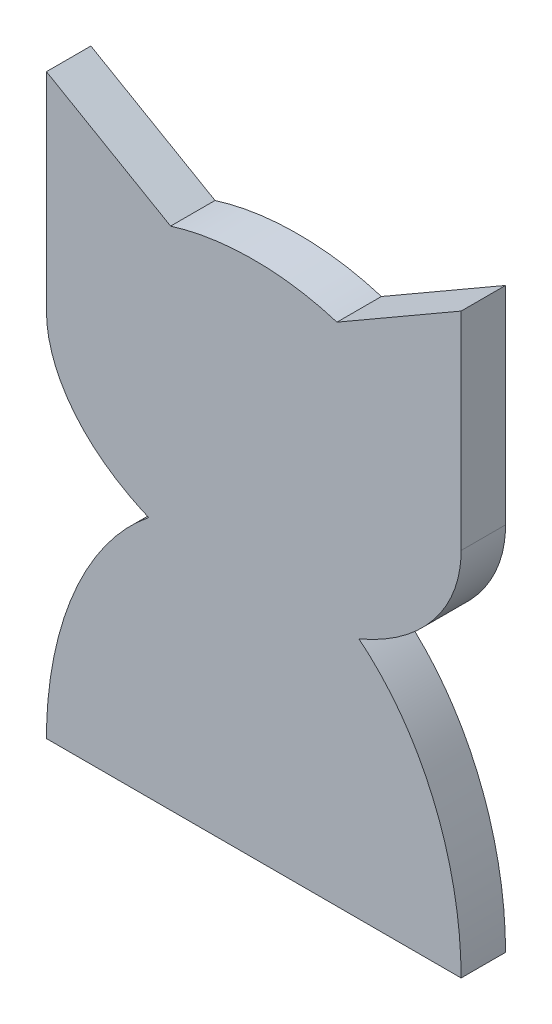
ISO-10303-21;
HEADER;
FILE_DESCRIPTION(('STEP AP214'),'2;1');
FILE_NAME('part.step','',(''),(''),'','','');
FILE_SCHEMA(('AUTOMOTIVE_DESIGN { 1 0 10303 214 1 1 1 1 }'));
ENDSEC;
DATA;
#1=APPLICATION_CONTEXT('core data for automotive mechanical design processes');
#2=APPLICATION_PROTOCOL_DEFINITION('international standard','automotive_design',2000,#1);
#3=PRODUCT_CONTEXT('',#1,'mechanical');
#4=PRODUCT('Part','Part','',(#3));
#5=PRODUCT_RELATED_PRODUCT_CATEGORY('part','',(#4));
#6=PRODUCT_DEFINITION_FORMATION('','',#4);
#7=PRODUCT_DEFINITION_CONTEXT('part definition',#1,'design');
#8=PRODUCT_DEFINITION('design','',#6,#7);
#9=PRODUCT_DEFINITION_SHAPE('','',#8);
#10=(LENGTH_UNIT() NAMED_UNIT(*) SI_UNIT(.MILLI.,.METRE.));
#11=(NAMED_UNIT(*) PLANE_ANGLE_UNIT() SI_UNIT($,.RADIAN.));
#12=(NAMED_UNIT(*) SI_UNIT($,.STERADIAN.) SOLID_ANGLE_UNIT());
#13=UNCERTAINTY_MEASURE_WITH_UNIT(LENGTH_MEASURE(1.E-05),#10,'distance_accuracy_value','');
#14=(GEOMETRIC_REPRESENTATION_CONTEXT(3) GLOBAL_UNCERTAINTY_ASSIGNED_CONTEXT((#13)) GLOBAL_UNIT_ASSIGNED_CONTEXT((#10,
#11,#12)) REPRESENTATION_CONTEXT('',''));
#15=CARTESIAN_POINT('',(0.,0.,0.));
#16=DIRECTION('',(0.,0.,1.));
#17=DIRECTION('',(1.,0.,0.));
#18=AXIS2_PLACEMENT_3D('',#15,#16,#17);
#19=CARTESIAN_POINT('',(11.,25.,3.));
#20=DIRECTION('',(-1.,0.,0.));
#21=DIRECTION('',(0.,0.,1.));
#22=AXIS2_PLACEMENT_3D('',#19,#20,#21);
#23=PLANE('',#22);
#24=DIRECTION('',(0.,1.,0.));
#25=VECTOR('',#24,1.);
#26=CARTESIAN_POINT('',(11.,25.,0.));
#27=LINE('',#26,#25);
#28=CARTESIAN_POINT('',(11.,25.,0.));
#29=VERTEX_POINT('',#28);
#30=CARTESIAN_POINT('',(11.,39.,0.));
#31=VERTEX_POINT('',#30);
#32=EDGE_CURVE('E200',#29,#31,#27,.T.);
#33=ORIENTED_EDGE('',*,*,#32,.F.);
#34=DIRECTION('',(0.,0.,-1.));
#35=VECTOR('',#34,1.);
#36=CARTESIAN_POINT('',(11.,25.,3.));
#37=LINE('',#36,#35);
#38=CARTESIAN_POINT('',(11.,25.,3.));
#39=VERTEX_POINT('',#38);
#40=EDGE_CURVE('E11',#39,#29,#37,.T.);
#41=ORIENTED_EDGE('',*,*,#40,.F.);
#42=DIRECTION('',(0.,1.,0.));
#43=VECTOR('',#42,1.);
#44=CARTESIAN_POINT('',(11.,25.,3.));
#45=LINE('',#44,#43);
#46=CARTESIAN_POINT('',(11.,39.,3.));
#47=VERTEX_POINT('',#46);
#48=EDGE_CURVE('E220',#39,#47,#45,.T.);
#49=ORIENTED_EDGE('',*,*,#48,.T.);
#50=DIRECTION('',(0.,0.,-1.));
#51=VECTOR('',#50,1.);
#52=CARTESIAN_POINT('',(11.,39.,3.));
#53=LINE('',#52,#51);
#54=EDGE_CURVE('E44',#47,#31,#53,.T.);
#55=ORIENTED_EDGE('',*,*,#54,.T.);
#56=EDGE_LOOP('',(#33,#41,#49,#55));
#57=FACE_BOUND('',#56,.T.);
#58=ADVANCED_FACE('F41',(#57),#23,.T.);
#59=CARTESIAN_POINT('',(25.,25.,3.));
#60=DIRECTION('',(0.,0.,1.));
#61=DIRECTION('',(1.,0.,0.));
#62=AXIS2_PLACEMENT_3D('',#59,#60,#61);
#63=ELLIPSE('',#62,14.,10.);
#64=DIRECTION('',(0.,0.,-1.));
#65=VECTOR('',#64,1.);
#66=SURFACE_OF_LINEAR_EXTRUSION('',#63,#65);
#67=CARTESIAN_POINT('',(25.,25.,0.));
#68=DIRECTION('',(0.,0.,1.));
#69=DIRECTION('',(1.,0.,0.));
#70=AXIS2_PLACEMENT_3D('',#67,#68,#69);
#71=ELLIPSE('',#70,14.,10.);
#72=CARTESIAN_POINT('',(17.9049262622832,16.3793103448276,0.));
#73=VERTEX_POINT('',#72);
#74=EDGE_CURVE('E92',#29,#73,#71,.T.);
#75=ORIENTED_EDGE('',*,*,#74,.T.);
#76=DIRECTION('',(0.,0.,-1.));
#77=VECTOR('',#76,1.);
#78=CARTESIAN_POINT('',(17.9049262622832,16.3793103448276,3.));
#79=LINE('',#78,#77);
#80=CARTESIAN_POINT('',(17.9049262622832,16.3793103448276,3.));
#81=VERTEX_POINT('',#80);
#82=EDGE_CURVE('E50',#81,#73,#79,.T.);
#83=ORIENTED_EDGE('',*,*,#82,.F.);
#84=EDGE_CURVE('E129',#39,#81,#63,.T.);
#85=ORIENTED_EDGE('',*,*,#84,.F.);
#86=ORIENTED_EDGE('',*,*,#40,.T.);
#87=EDGE_LOOP('',(#75,#83,#85,#86));
#88=FACE_BOUND('',#87,.T.);
#89=ADVANCED_FACE('F158',(#88),#66,.F.);
#90=CARTESIAN_POINT('',(25.,0.,3.));
#91=DIRECTION('',(0.,0.,1.));
#92=DIRECTION('',(0.,1.,0.));
#93=AXIS2_PLACEMENT_3D('',#90,#91,#92);
#94=ELLIPSE('',#93,19.,14.);
#95=DIRECTION('',(0.,0.,-1.));
#96=VECTOR('',#95,1.);
#97=SURFACE_OF_LINEAR_EXTRUSION('',#94,#96);
#98=CARTESIAN_POINT('',(25.,0.,0.));
#99=DIRECTION('',(0.,0.,1.));
#100=DIRECTION('',(0.,1.,0.));
#101=AXIS2_PLACEMENT_3D('',#98,#99,#100);
#102=ELLIPSE('',#101,19.,14.);
#103=CARTESIAN_POINT('',(11.,0.,0.));
#104=VERTEX_POINT('',#103);
#105=EDGE_CURVE('E136',#73,#104,#102,.T.);
#106=ORIENTED_EDGE('',*,*,#105,.T.);
#107=DIRECTION('',(0.,0.,-1.));
#108=VECTOR('',#107,1.);
#109=CARTESIAN_POINT('',(11.,0.,3.));
#110=LINE('',#109,#108);
#111=CARTESIAN_POINT('',(11.,0.,3.));
#112=VERTEX_POINT('',#111);
#113=EDGE_CURVE('E133',#112,#104,#110,.T.);
#114=ORIENTED_EDGE('',*,*,#113,.F.);
#115=EDGE_CURVE('E122',#81,#112,#94,.T.);
#116=ORIENTED_EDGE('',*,*,#115,.F.);
#117=ORIENTED_EDGE('',*,*,#82,.T.);
#118=EDGE_LOOP('',(#106,#114,#116,#117));
#119=FACE_BOUND('',#118,.T.);
#120=ADVANCED_FACE('F134',(#119),#97,.F.);
#121=CARTESIAN_POINT('',(11.,0.,3.));
#122=DIRECTION('',(0.,1.,0.));
#123=DIRECTION('',(-1.,0.,0.));
#124=AXIS2_PLACEMENT_3D('',#121,#122,#123);
#125=PLANE('',#124);
#126=DIRECTION('',(1.,0.,0.));
#127=VECTOR('',#126,1.);
#128=CARTESIAN_POINT('',(11.,0.,0.));
#129=LINE('',#128,#127);
#130=CARTESIAN_POINT('',(39.,0.,0.));
#131=VERTEX_POINT('',#130);
#132=EDGE_CURVE('E217',#104,#131,#129,.T.);
#133=ORIENTED_EDGE('',*,*,#132,.T.);
#134=DIRECTION('',(0.,0.,-1.));
#135=VECTOR('',#134,1.);
#136=CARTESIAN_POINT('',(39.,0.,3.));
#137=LINE('',#136,#135);
#138=CARTESIAN_POINT('',(39.,0.,3.));
#139=VERTEX_POINT('',#138);
#140=EDGE_CURVE('E139',#139,#131,#137,.T.);
#141=ORIENTED_EDGE('',*,*,#140,.F.);
#142=DIRECTION('',(1.,0.,0.));
#143=VECTOR('',#142,1.);
#144=CARTESIAN_POINT('',(11.,0.,3.));
#145=LINE('',#144,#143);
#146=EDGE_CURVE('E127',#112,#139,#145,.T.);
#147=ORIENTED_EDGE('',*,*,#146,.F.);
#148=ORIENTED_EDGE('',*,*,#113,.T.);
#149=EDGE_LOOP('',(#133,#141,#147,#148));
#150=FACE_BOUND('',#149,.T.);
#151=ADVANCED_FACE('F141',(#150),#125,.F.);
#152=CARTESIAN_POINT('',(25.,0.,3.));
#153=DIRECTION('',(0.,0.,1.));
#154=DIRECTION('',(0.,1.,0.));
#155=AXIS2_PLACEMENT_3D('',#152,#153,#154);
#156=ELLIPSE('',#155,19.,14.);
#157=DIRECTION('',(0.,0.,-1.));
#158=VECTOR('',#157,1.);
#159=SURFACE_OF_LINEAR_EXTRUSION('',#156,#158);
#160=CARTESIAN_POINT('',(25.,0.,0.));
#161=DIRECTION('',(0.,0.,1.));
#162=DIRECTION('',(0.,1.,0.));
#163=AXIS2_PLACEMENT_3D('',#160,#161,#162);
#164=ELLIPSE('',#163,19.,14.);
#165=CARTESIAN_POINT('',(32.0950737377168,16.3793103448276,0.));
#166=VERTEX_POINT('',#165);
#167=EDGE_CURVE('E215',#131,#166,#164,.T.);
#168=ORIENTED_EDGE('',*,*,#167,.T.);
#169=DIRECTION('',(0.,0.,-1.));
#170=VECTOR('',#169,1.);
#171=CARTESIAN_POINT('',(32.0950737377168,16.3793103448276,3.));
#172=LINE('',#171,#170);
#173=CARTESIAN_POINT('',(32.0950737377168,16.3793103448276,3.));
#174=VERTEX_POINT('',#173);
#175=EDGE_CURVE('E224',#174,#166,#172,.T.);
#176=ORIENTED_EDGE('',*,*,#175,.F.);
#177=EDGE_CURVE('E144',#139,#174,#156,.T.);
#178=ORIENTED_EDGE('',*,*,#177,.F.);
#179=ORIENTED_EDGE('',*,*,#140,.T.);
#180=EDGE_LOOP('',(#168,#176,#178,#179));
#181=FACE_BOUND('',#180,.T.);
#182=ADVANCED_FACE('F162',(#181),#159,.F.);
#183=CARTESIAN_POINT('',(25.,25.,3.));
#184=DIRECTION('',(0.,0.,1.));
#185=DIRECTION('',(1.,0.,0.));
#186=AXIS2_PLACEMENT_3D('',#183,#184,#185);
#187=ELLIPSE('',#186,14.,10.);
#188=DIRECTION('',(0.,0.,-1.));
#189=VECTOR('',#188,1.);
#190=SURFACE_OF_LINEAR_EXTRUSION('',#187,#189);
#191=CARTESIAN_POINT('',(25.,25.,0.));
#192=DIRECTION('',(0.,0.,1.));
#193=DIRECTION('',(1.,0.,0.));
#194=AXIS2_PLACEMENT_3D('',#191,#192,#193);
#195=ELLIPSE('',#194,14.,10.);
#196=CARTESIAN_POINT('',(39.,25.,0.));
#197=VERTEX_POINT('',#196);
#198=EDGE_CURVE('E213',#166,#197,#195,.T.);
#199=ORIENTED_EDGE('',*,*,#198,.T.);
#200=DIRECTION('',(0.,0.,-1.));
#201=VECTOR('',#200,1.);
#202=CARTESIAN_POINT('',(39.,25.,3.));
#203=LINE('',#202,#201);
#204=CARTESIAN_POINT('',(39.,25.,3.));
#205=VERTEX_POINT('',#204);
#206=EDGE_CURVE('E227',#205,#197,#203,.T.);
#207=ORIENTED_EDGE('',*,*,#206,.F.);
#208=EDGE_CURVE('E146',#174,#205,#187,.T.);
#209=ORIENTED_EDGE('',*,*,#208,.F.);
#210=ORIENTED_EDGE('',*,*,#175,.T.);
#211=EDGE_LOOP('',(#199,#207,#209,#210));
#212=FACE_BOUND('',#211,.T.);
#213=ADVANCED_FACE('F165',(#212),#190,.F.);
#214=CARTESIAN_POINT('',(39.,25.,3.));
#215=DIRECTION('',(-1.,0.,0.));
#216=DIRECTION('',(0.,0.,1.));
#217=AXIS2_PLACEMENT_3D('',#214,#215,#216);
#218=PLANE('',#217);
#219=DIRECTION('',(0.,1.,0.));
#220=VECTOR('',#219,1.);
#221=CARTESIAN_POINT('',(39.,25.,0.));
#222=LINE('',#221,#220);
#223=CARTESIAN_POINT('',(39.,39.,0.));
#224=VERTEX_POINT('',#223);
#225=EDGE_CURVE('E211',#197,#224,#222,.T.);
#226=ORIENTED_EDGE('',*,*,#225,.T.);
#227=DIRECTION('',(0.,0.,-1.));
#228=VECTOR('',#227,1.);
#229=CARTESIAN_POINT('',(39.,39.,3.));
#230=LINE('',#229,#228);
#231=CARTESIAN_POINT('',(39.,39.,3.));
#232=VERTEX_POINT('',#231);
#233=EDGE_CURVE('E230',#232,#224,#230,.T.);
#234=ORIENTED_EDGE('',*,*,#233,.F.);
#235=DIRECTION('',(0.,1.,0.));
#236=VECTOR('',#235,1.);
#237=CARTESIAN_POINT('',(39.,25.,3.));
#238=LINE('',#237,#236);
#239=EDGE_CURVE('E174',#205,#232,#238,.T.);
#240=ORIENTED_EDGE('',*,*,#239,.F.);
#241=ORIENTED_EDGE('',*,*,#206,.T.);
#242=EDGE_LOOP('',(#226,#234,#240,#241));
#243=FACE_BOUND('',#242,.T.);
#244=ADVANCED_FACE('F169',(#243),#218,.F.);
#245=CARTESIAN_POINT('',(39.,39.,3.));
#246=DIRECTION('',(0.500000000000004,-0.866025403784436,0.));
#247=DIRECTION('',(0.866025403784436,0.500000000000004,0.));
#248=AXIS2_PLACEMENT_3D('',#245,#246,#247);
#249=PLANE('',#248);
#250=DIRECTION('',(-0.866025403784436,-0.500000000000004,0.));
#251=VECTOR('',#250,1.);
#252=CARTESIAN_POINT('',(39.,39.,0.));
#253=LINE('',#252,#251);
#254=CARTESIAN_POINT('',(30.6167411141483,34.1599232255671,0.));
#255=VERTEX_POINT('',#254);
#256=EDGE_CURVE('E209',#224,#255,#253,.T.);
#257=ORIENTED_EDGE('',*,*,#256,.T.);
#258=DIRECTION('',(0.,0.,-1.));
#259=VECTOR('',#258,1.);
#260=CARTESIAN_POINT('',(30.6167411141483,34.1599232255671,3.));
#261=LINE('',#260,#259);
#262=CARTESIAN_POINT('',(30.6167411141483,34.1599232255671,3.));
#263=VERTEX_POINT('',#262);
#264=EDGE_CURVE('E233',#263,#255,#261,.T.);
#265=ORIENTED_EDGE('',*,*,#264,.F.);
#266=DIRECTION('',(-0.866025403784436,-0.500000000000004,0.));
#267=VECTOR('',#266,1.);
#268=CARTESIAN_POINT('',(39.,39.,3.));
#269=LINE('',#268,#267);
#270=EDGE_CURVE('E176',#232,#263,#269,.T.);
#271=ORIENTED_EDGE('',*,*,#270,.F.);
#272=ORIENTED_EDGE('',*,*,#233,.T.);
#273=EDGE_LOOP('',(#257,#265,#271,#272));
#274=FACE_BOUND('',#273,.T.);
#275=ADVANCED_FACE('F187',(#274),#249,.F.);
#276=CARTESIAN_POINT('',(25.,25.,3.));
#277=DIRECTION('',(0.,0.,1.));
#278=DIRECTION('',(1.,0.,0.));
#279=AXIS2_PLACEMENT_3D('',#276,#277,#278);
#280=ELLIPSE('',#279,14.,10.);
#281=DIRECTION('',(0.,0.,-1.));
#282=VECTOR('',#281,1.);
#283=SURFACE_OF_LINEAR_EXTRUSION('',#280,#282);
#284=CARTESIAN_POINT('',(25.,25.,0.));
#285=DIRECTION('',(0.,0.,1.));
#286=DIRECTION('',(1.,0.,0.));
#287=AXIS2_PLACEMENT_3D('',#284,#285,#286);
#288=ELLIPSE('',#287,14.,10.);
#289=CARTESIAN_POINT('',(19.3832588858516,34.1599232255671,0.));
#290=VERTEX_POINT('',#289);
#291=EDGE_CURVE('E204',#255,#290,#288,.T.);
#292=ORIENTED_EDGE('',*,*,#291,.T.);
#293=DIRECTION('',(0.,0.,-1.));
#294=VECTOR('',#293,1.);
#295=CARTESIAN_POINT('',(19.3832588858516,34.1599232255671,3.));
#296=LINE('',#295,#294);
#297=CARTESIAN_POINT('',(19.3832588858516,34.1599232255671,3.));
#298=VERTEX_POINT('',#297);
#299=EDGE_CURVE('E235',#298,#290,#296,.T.);
#300=ORIENTED_EDGE('',*,*,#299,.F.);
#301=EDGE_CURVE('E178',#263,#298,#280,.T.);
#302=ORIENTED_EDGE('',*,*,#301,.F.);
#303=ORIENTED_EDGE('',*,*,#264,.T.);
#304=EDGE_LOOP('',(#292,#300,#302,#303));
#305=FACE_BOUND('',#304,.T.);
#306=ADVANCED_FACE('F184',(#305),#283,.F.);
#307=CARTESIAN_POINT('',(11.,39.,3.));
#308=DIRECTION('',(0.500000000000013,0.866025403784431,0.));
#309=DIRECTION('',(-0.866025403784431,0.500000000000013,0.));
#310=AXIS2_PLACEMENT_3D('',#307,#308,#309);
#311=PLANE('',#310);
#312=DIRECTION('',(0.866025403784431,-0.500000000000013,0.));
#313=VECTOR('',#312,1.);
#314=CARTESIAN_POINT('',(11.,39.,0.));
#315=LINE('',#314,#313);
#316=EDGE_CURVE('E203',#31,#290,#315,.T.);
#317=ORIENTED_EDGE('',*,*,#316,.F.);
#318=ORIENTED_EDGE('',*,*,#54,.F.);
#319=DIRECTION('',(0.866025403784431,-0.500000000000013,0.));
#320=VECTOR('',#319,1.);
#321=CARTESIAN_POINT('',(11.,39.,3.));
#322=LINE('',#321,#320);
#323=EDGE_CURVE('E181',#47,#298,#322,.T.);
#324=ORIENTED_EDGE('',*,*,#323,.T.);
#325=ORIENTED_EDGE('',*,*,#299,.T.);
#326=EDGE_LOOP('',(#317,#318,#324,#325));
#327=FACE_BOUND('',#326,.T.);
#328=ADVANCED_FACE('F186',(#327),#311,.T.);
#329=CARTESIAN_POINT('',(25.,25.,3.));
#330=DIRECTION('',(0.,0.,1.));
#331=DIRECTION('',(1.,0.,0.));
#332=AXIS2_PLACEMENT_3D('',#329,#330,#331);
#333=PLANE('',#332);
#334=ORIENTED_EDGE('',*,*,#48,.F.);
#335=ORIENTED_EDGE('',*,*,#84,.T.);
#336=ORIENTED_EDGE('',*,*,#115,.T.);
#337=ORIENTED_EDGE('',*,*,#146,.T.);
#338=ORIENTED_EDGE('',*,*,#177,.T.);
#339=ORIENTED_EDGE('',*,*,#208,.T.);
#340=ORIENTED_EDGE('',*,*,#239,.T.);
#341=ORIENTED_EDGE('',*,*,#270,.T.);
#342=ORIENTED_EDGE('',*,*,#301,.T.);
#343=ORIENTED_EDGE('',*,*,#323,.F.);
#344=EDGE_LOOP('',(#334,#335,#336,#337,#338,#339,#340,#341,#342,#343));
#345=FACE_BOUND('',#344,.T.);
#346=ADVANCED_FACE('F125',(#345),#333,.T.);
#347=CARTESIAN_POINT('',(25.,25.,0.));
#348=DIRECTION('',(0.,0.,1.));
#349=DIRECTION('',(1.,0.,0.));
#350=AXIS2_PLACEMENT_3D('',#347,#348,#349);
#351=PLANE('',#350);
#352=ORIENTED_EDGE('',*,*,#32,.T.);
#353=ORIENTED_EDGE('',*,*,#316,.T.);
#354=ORIENTED_EDGE('',*,*,#291,.F.);
#355=ORIENTED_EDGE('',*,*,#256,.F.);
#356=ORIENTED_EDGE('',*,*,#225,.F.);
#357=ORIENTED_EDGE('',*,*,#198,.F.);
#358=ORIENTED_EDGE('',*,*,#167,.F.);
#359=ORIENTED_EDGE('',*,*,#132,.F.);
#360=ORIENTED_EDGE('',*,*,#105,.F.);
#361=ORIENTED_EDGE('',*,*,#74,.F.);
#362=EDGE_LOOP('',(#352,#353,#354,#355,#356,#357,#358,#359,#360,#361));
#363=FACE_BOUND('',#362,.T.);
#364=ADVANCED_FACE('F193',(#363),#351,.F.);
#365=CLOSED_SHELL('',(#58,#89,#120,#151,#182,#213,#244,#275,#306,#328,#346,#364));
#366=MANIFOLD_SOLID_BREP('B2',#365);
#367=ADVANCED_BREP_SHAPE_REPRESENTATION('',(#18,#366),#14);
#368=SHAPE_DEFINITION_REPRESENTATION(#9,#367);
ENDSEC;
END-ISO-10303-21;
